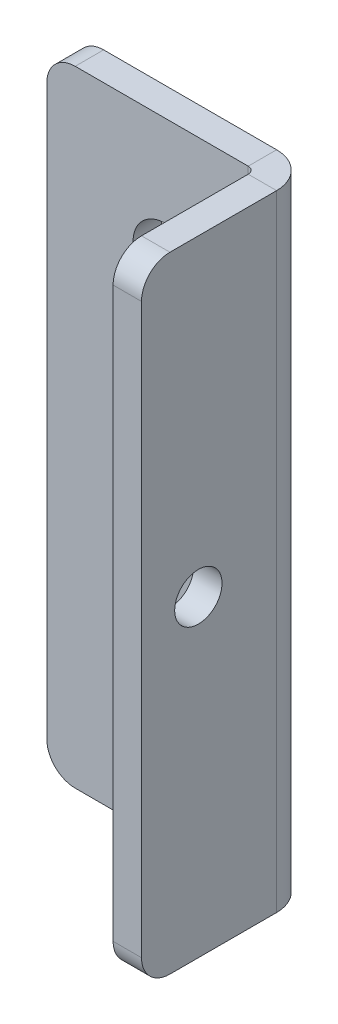
ISO-10303-21;
HEADER;
FILE_DESCRIPTION(('STEP AP214'),'2;1');
FILE_NAME('part.step','',(''),(''),'','','');
FILE_SCHEMA(('AUTOMOTIVE_DESIGN { 1 0 10303 214 1 1 1 1 }'));
ENDSEC;
DATA;
#1=APPLICATION_CONTEXT('core data for automotive mechanical design processes');
#2=APPLICATION_PROTOCOL_DEFINITION('international standard','automotive_design',2000,#1);
#3=PRODUCT_CONTEXT('',#1,'mechanical');
#4=PRODUCT('Part','Part','',(#3));
#5=PRODUCT_RELATED_PRODUCT_CATEGORY('part','',(#4));
#6=PRODUCT_DEFINITION_FORMATION('','',#4);
#7=PRODUCT_DEFINITION_CONTEXT('part definition',#1,'design');
#8=PRODUCT_DEFINITION('design','',#6,#7);
#9=PRODUCT_DEFINITION_SHAPE('','',#8);
#10=(LENGTH_UNIT() NAMED_UNIT(*) SI_UNIT(.MILLI.,.METRE.));
#11=(NAMED_UNIT(*) PLANE_ANGLE_UNIT() SI_UNIT($,.RADIAN.));
#12=(NAMED_UNIT(*) SI_UNIT($,.STERADIAN.) SOLID_ANGLE_UNIT());
#13=UNCERTAINTY_MEASURE_WITH_UNIT(LENGTH_MEASURE(1.E-05),#10,'distance_accuracy_value','');
#14=(GEOMETRIC_REPRESENTATION_CONTEXT(3) GLOBAL_UNCERTAINTY_ASSIGNED_CONTEXT((#13)) GLOBAL_UNIT_ASSIGNED_CONTEXT((#10,
#11,#12)) REPRESENTATION_CONTEXT('',''));
#15=CARTESIAN_POINT('',(0.,0.,0.));
#16=DIRECTION('',(0.,0.,1.));
#17=DIRECTION('',(1.,0.,0.));
#18=AXIS2_PLACEMENT_3D('',#15,#16,#17);
#19=CARTESIAN_POINT('',(-12.5,33.,-3.));
#20=DIRECTION('',(0.,1.,0.));
#21=DIRECTION('',(0.,0.,1.));
#22=AXIS2_PLACEMENT_3D('',#19,#20,#21);
#23=PLANE('',#22);
#24=DIRECTION('',(-1.,0.,0.));
#25=VECTOR('',#24,1.);
#26=CARTESIAN_POINT('',(-12.5,33.,-3.));
#27=LINE('',#26,#25);
#28=CARTESIAN_POINT('',(8.7634,33.,-3.));
#29=VERTEX_POINT('',#28);
#30=CARTESIAN_POINT('',(-9.5,33.,-3.));
#31=VERTEX_POINT('',#30);
#32=EDGE_CURVE('E226',#29,#31,#27,.T.);
#33=ORIENTED_EDGE('',*,*,#32,.T.);
#34=DIRECTION('',(0.,0.,1.));
#35=VECTOR('',#34,1.);
#36=CARTESIAN_POINT('',(-9.5,33.,-3.));
#37=LINE('',#36,#35);
#38=CARTESIAN_POINT('',(-9.5,33.,0.));
#39=VERTEX_POINT('',#38);
#40=EDGE_CURVE('E13',#31,#39,#37,.T.);
#41=ORIENTED_EDGE('',*,*,#40,.T.);
#42=DIRECTION('',(-1.,0.,0.));
#43=VECTOR('',#42,1.);
#44=CARTESIAN_POINT('',(-12.5,33.,0.));
#45=LINE('',#44,#43);
#46=CARTESIAN_POINT('',(8.7634,33.,0.));
#47=VERTEX_POINT('',#46);
#48=EDGE_CURVE('E224',#47,#39,#45,.T.);
#49=ORIENTED_EDGE('',*,*,#48,.F.);
#50=DIRECTION('',(0.,0.,-1.));
#51=VECTOR('',#50,1.);
#52=CARTESIAN_POINT('',(8.7634,33.,0.));
#53=LINE('',#52,#51);
#54=EDGE_CURVE('E213',#47,#29,#53,.T.);
#55=ORIENTED_EDGE('',*,*,#54,.T.);
#56=EDGE_LOOP('',(#33,#41,#49,#55));
#57=FACE_BOUND('',#56,.T.);
#58=ADVANCED_FACE('F65',(#57),#23,.T.);
#59=CARTESIAN_POINT('',(0.,0.,-3.));
#60=DIRECTION('',(0.,0.,-1.));
#61=DIRECTION('',(-1.,0.,0.));
#62=AXIS2_PLACEMENT_3D('',#59,#60,#61);
#63=PLANE('',#62);
#64=CARTESIAN_POINT('',(0.,20.,-3.));
#65=DIRECTION('',(0.,0.,1.));
#66=DIRECTION('',(1.,0.,0.));
#67=AXIS2_PLACEMENT_3D('',#64,#65,#66);
#68=CIRCLE('',#67,3.4);
#69=CARTESIAN_POINT('',(3.39999999999999,20.,-3.));
#70=VERTEX_POINT('',#69);
#71=EDGE_CURVE('E315',#70,#70,#68,.T.);
#72=ORIENTED_EDGE('',*,*,#71,.T.);
#73=EDGE_LOOP('',(#72));
#74=FACE_BOUND('',#73,.T.);
#75=CARTESIAN_POINT('',(0.,-20.,-3.));
#76=DIRECTION('',(0.,0.,1.));
#77=DIRECTION('',(1.,0.,0.));
#78=AXIS2_PLACEMENT_3D('',#75,#76,#77);
#79=CIRCLE('',#78,3.4);
#80=CARTESIAN_POINT('',(3.4,-20.,-3.));
#81=VERTEX_POINT('',#80);
#82=EDGE_CURVE('E210',#81,#81,#79,.T.);
#83=ORIENTED_EDGE('',*,*,#82,.T.);
#84=EDGE_LOOP('',(#83));
#85=FACE_BOUND('',#84,.T.);
#86=DIRECTION('',(1.,0.,0.));
#87=VECTOR('',#86,1.);
#88=CARTESIAN_POINT('',(-12.5,-33.,-3.));
#89=LINE('',#88,#87);
#90=CARTESIAN_POINT('',(-9.5,-33.,-3.));
#91=VERTEX_POINT('',#90);
#92=CARTESIAN_POINT('',(8.7634,-33.,-3.));
#93=VERTEX_POINT('',#92);
#94=EDGE_CURVE('E232',#91,#93,#89,.T.);
#95=ORIENTED_EDGE('',*,*,#94,.F.);
#96=CARTESIAN_POINT('',(-9.5,-30.,-3.));
#97=DIRECTION('',(0.,0.,-1.));
#98=DIRECTION('',(-1.,0.,0.));
#99=AXIS2_PLACEMENT_3D('',#96,#97,#98);
#100=CIRCLE('',#99,3.);
#101=CARTESIAN_POINT('',(-12.5,-30.,-3.));
#102=VERTEX_POINT('',#101);
#103=EDGE_CURVE('E73',#91,#102,#100,.T.);
#104=ORIENTED_EDGE('',*,*,#103,.T.);
#105=DIRECTION('',(0.,-1.,0.));
#106=VECTOR('',#105,1.);
#107=CARTESIAN_POINT('',(-12.5,-33.,-3.));
#108=LINE('',#107,#106);
#109=CARTESIAN_POINT('',(-12.5,30.,-3.));
#110=VERTEX_POINT('',#109);
#111=EDGE_CURVE('E228',#110,#102,#108,.T.);
#112=ORIENTED_EDGE('',*,*,#111,.F.);
#113=CARTESIAN_POINT('',(-9.5,30.,-3.));
#114=DIRECTION('',(0.,0.,-1.));
#115=DIRECTION('',(-1.,0.,0.));
#116=AXIS2_PLACEMENT_3D('',#113,#114,#115);
#117=CIRCLE('',#116,3.);
#118=EDGE_CURVE('E80',#110,#31,#117,.T.);
#119=ORIENTED_EDGE('',*,*,#118,.T.);
#120=ORIENTED_EDGE('',*,*,#32,.F.);
#121=DIRECTION('',(0.,1.,0.));
#122=VECTOR('',#121,1.);
#123=CARTESIAN_POINT('',(8.7634,33.,-3.));
#124=LINE('',#123,#122);
#125=EDGE_CURVE('E165',#29,#93,#124,.F.);
#126=ORIENTED_EDGE('',*,*,#125,.T.);
#127=EDGE_LOOP('',(#95,#104,#112,#119,#120,#126));
#128=FACE_BOUND('',#127,.T.);
#129=ADVANCED_FACE('F268',(#74,#85,#128),#63,.T.);
#130=CARTESIAN_POINT('',(0.,0.,0.));
#131=DIRECTION('',(0.,0.,-1.));
#132=DIRECTION('',(-1.,0.,0.));
#133=AXIS2_PLACEMENT_3D('',#130,#131,#132);
#134=PLANE('',#133);
#135=CARTESIAN_POINT('',(0.,20.,0.));
#136=DIRECTION('',(0.,0.,1.));
#137=DIRECTION('',(1.,0.,0.));
#138=AXIS2_PLACEMENT_3D('',#135,#136,#137);
#139=CIRCLE('',#138,3.4);
#140=CARTESIAN_POINT('',(3.39999999999999,20.,0.));
#141=VERTEX_POINT('',#140);
#142=EDGE_CURVE('E318',#141,#141,#139,.T.);
#143=ORIENTED_EDGE('',*,*,#142,.F.);
#144=EDGE_LOOP('',(#143));
#145=FACE_BOUND('',#144,.T.);
#146=CARTESIAN_POINT('',(0.,-20.,0.));
#147=DIRECTION('',(0.,0.,1.));
#148=DIRECTION('',(1.,0.,0.));
#149=AXIS2_PLACEMENT_3D('',#146,#147,#148);
#150=CIRCLE('',#149,3.4);
#151=CARTESIAN_POINT('',(3.4,-20.,0.));
#152=VERTEX_POINT('',#151);
#153=EDGE_CURVE('E312',#152,#152,#150,.T.);
#154=ORIENTED_EDGE('',*,*,#153,.F.);
#155=EDGE_LOOP('',(#154));
#156=FACE_BOUND('',#155,.T.);
#157=DIRECTION('',(0.,-1.,0.));
#158=VECTOR('',#157,1.);
#159=CARTESIAN_POINT('',(-12.5,-33.,0.));
#160=LINE('',#159,#158);
#161=CARTESIAN_POINT('',(-12.5,30.,0.));
#162=VERTEX_POINT('',#161);
#163=CARTESIAN_POINT('',(-12.5,-30.,0.));
#164=VERTEX_POINT('',#163);
#165=EDGE_CURVE('E237',#162,#164,#160,.T.);
#166=ORIENTED_EDGE('',*,*,#165,.T.);
#167=CARTESIAN_POINT('',(-9.5,-30.,0.));
#168=DIRECTION('',(0.,0.,-1.));
#169=DIRECTION('',(-1.,0.,0.));
#170=AXIS2_PLACEMENT_3D('',#167,#168,#169);
#171=CIRCLE('',#170,3.);
#172=CARTESIAN_POINT('',(-9.5,-33.,0.));
#173=VERTEX_POINT('',#172);
#174=EDGE_CURVE('E264',#164,#173,#171,.F.);
#175=ORIENTED_EDGE('',*,*,#174,.T.);
#176=DIRECTION('',(1.,0.,0.));
#177=VECTOR('',#176,1.);
#178=CARTESIAN_POINT('',(-12.5,-33.,0.));
#179=LINE('',#178,#177);
#180=CARTESIAN_POINT('',(8.7634,-33.,0.));
#181=VERTEX_POINT('',#180);
#182=EDGE_CURVE('E229',#173,#181,#179,.T.);
#183=ORIENTED_EDGE('',*,*,#182,.T.);
#184=DIRECTION('',(0.,1.,0.));
#185=VECTOR('',#184,1.);
#186=CARTESIAN_POINT('',(8.7634,33.,0.));
#187=LINE('',#186,#185);
#188=EDGE_CURVE('E217',#47,#181,#187,.F.);
#189=ORIENTED_EDGE('',*,*,#188,.F.);
#190=ORIENTED_EDGE('',*,*,#48,.T.);
#191=CARTESIAN_POINT('',(-9.5,30.,0.));
#192=DIRECTION('',(0.,0.,-1.));
#193=DIRECTION('',(-1.,0.,0.));
#194=AXIS2_PLACEMENT_3D('',#191,#192,#193);
#195=CIRCLE('',#194,3.);
#196=EDGE_CURVE('E262',#39,#162,#195,.F.);
#197=ORIENTED_EDGE('',*,*,#196,.T.);
#198=EDGE_LOOP('',(#166,#175,#183,#189,#190,#197));
#199=FACE_BOUND('',#198,.T.);
#200=ADVANCED_FACE('F277',(#145,#156,#199),#134,.F.);
#201=CARTESIAN_POINT('',(-12.5,-33.,-3.));
#202=DIRECTION('',(0.,-1.,0.));
#203=DIRECTION('',(0.,0.,-1.));
#204=AXIS2_PLACEMENT_3D('',#201,#202,#203);
#205=PLANE('',#204);
#206=ORIENTED_EDGE('',*,*,#182,.F.);
#207=DIRECTION('',(0.,0.,1.));
#208=VECTOR('',#207,1.);
#209=CARTESIAN_POINT('',(-9.5,-33.,-3.));
#210=LINE('',#209,#208);
#211=EDGE_CURVE('E88',#173,#91,#210,.F.);
#212=ORIENTED_EDGE('',*,*,#211,.T.);
#213=ORIENTED_EDGE('',*,*,#94,.T.);
#214=DIRECTION('',(0.,0.,-1.));
#215=VECTOR('',#214,1.);
#216=CARTESIAN_POINT('',(8.7634,-33.,0.));
#217=LINE('',#216,#215);
#218=EDGE_CURVE('E221',#181,#93,#217,.T.);
#219=ORIENTED_EDGE('',*,*,#218,.F.);
#220=EDGE_LOOP('',(#206,#212,#213,#219));
#221=FACE_BOUND('',#220,.T.);
#222=ADVANCED_FACE('F280',(#221),#205,.T.);
#223=CARTESIAN_POINT('',(-12.5,-33.,-3.));
#224=DIRECTION('',(-1.,0.,0.));
#225=DIRECTION('',(0.,0.,1.));
#226=AXIS2_PLACEMENT_3D('',#223,#224,#225);
#227=PLANE('',#226);
#228=ORIENTED_EDGE('',*,*,#111,.T.);
#229=DIRECTION('',(0.,0.,1.));
#230=VECTOR('',#229,1.);
#231=CARTESIAN_POINT('',(-12.5,-30.,-3.));
#232=LINE('',#231,#230);
#233=EDGE_CURVE('E259',#102,#164,#232,.T.);
#234=ORIENTED_EDGE('',*,*,#233,.T.);
#235=ORIENTED_EDGE('',*,*,#165,.F.);
#236=DIRECTION('',(0.,0.,1.));
#237=VECTOR('',#236,1.);
#238=CARTESIAN_POINT('',(-12.5,30.,-3.));
#239=LINE('',#238,#237);
#240=EDGE_CURVE('E257',#162,#110,#239,.F.);
#241=ORIENTED_EDGE('',*,*,#240,.T.);
#242=EDGE_LOOP('',(#228,#234,#235,#241));
#243=FACE_BOUND('',#242,.T.);
#244=ADVANCED_FACE('F272',(#243),#227,.T.);
#245=CARTESIAN_POINT('',(8.7634,-33.,0.7366));
#246=DIRECTION('',(0.,-1.,0.));
#247=DIRECTION('',(0.,0.,-1.));
#248=AXIS2_PLACEMENT_3D('',#245,#246,#247);
#249=PLANE('',#248);
#250=DIRECTION('',(-1.,0.,0.));
#251=VECTOR('',#250,1.);
#252=CARTESIAN_POINT('',(12.5,-33.,0.736599999999986));
#253=LINE('',#252,#251);
#254=CARTESIAN_POINT('',(9.50000000000001,-33.,0.736599999999998));
#255=VERTEX_POINT('',#254);
#256=CARTESIAN_POINT('',(12.5,-33.,0.736599999999987));
#257=VERTEX_POINT('',#256);
#258=EDGE_CURVE('E207',#255,#257,#253,.F.);
#259=ORIENTED_EDGE('',*,*,#258,.F.);
#260=CARTESIAN_POINT('',(8.7634,-33.,0.7366));
#261=DIRECTION('',(0.,1.,0.));
#262=DIRECTION('',(0.,0.,1.));
#263=AXIS2_PLACEMENT_3D('',#260,#261,#262);
#264=CIRCLE('',#263,0.7366);
#265=EDGE_CURVE('E168',#181,#255,#264,.F.);
#266=ORIENTED_EDGE('',*,*,#265,.F.);
#267=ORIENTED_EDGE('',*,*,#218,.T.);
#268=CARTESIAN_POINT('',(8.7634,-33.,0.7366));
#269=DIRECTION('',(0.,1.,0.));
#270=DIRECTION('',(0.,0.,1.));
#271=AXIS2_PLACEMENT_3D('',#268,#269,#270);
#272=CIRCLE('',#271,3.7366);
#273=EDGE_CURVE('E212',#93,#257,#272,.F.);
#274=ORIENTED_EDGE('',*,*,#273,.T.);
#275=EDGE_LOOP('',(#259,#266,#267,#274));
#276=FACE_BOUND('',#275,.T.);
#277=ADVANCED_FACE('F284',(#276),#249,.T.);
#278=CARTESIAN_POINT('',(8.7634,33.,0.7366));
#279=DIRECTION('',(0.,-1.,0.));
#280=DIRECTION('',(0.,0.,-1.));
#281=AXIS2_PLACEMENT_3D('',#278,#279,#280);
#282=PLANE('',#281);
#283=CARTESIAN_POINT('',(8.7634,33.,0.7366));
#284=DIRECTION('',(0.,1.,0.));
#285=DIRECTION('',(0.,0.,1.));
#286=AXIS2_PLACEMENT_3D('',#283,#284,#285);
#287=CIRCLE('',#286,0.7366);
#288=CARTESIAN_POINT('',(9.50000000000001,33.,0.736599999999998));
#289=VERTEX_POINT('',#288);
#290=EDGE_CURVE('E175',#289,#47,#287,.T.);
#291=ORIENTED_EDGE('',*,*,#290,.F.);
#292=DIRECTION('',(-1.,0.,0.));
#293=VECTOR('',#292,1.);
#294=CARTESIAN_POINT('',(9.5,33.,0.736599999999999));
#295=LINE('',#294,#293);
#296=CARTESIAN_POINT('',(12.5,33.,0.736599999999988));
#297=VERTEX_POINT('',#296);
#298=EDGE_CURVE('E172',#289,#297,#295,.F.);
#299=ORIENTED_EDGE('',*,*,#298,.T.);
#300=CARTESIAN_POINT('',(8.7634,33.,0.7366));
#301=DIRECTION('',(0.,1.,0.));
#302=DIRECTION('',(0.,0.,1.));
#303=AXIS2_PLACEMENT_3D('',#300,#301,#302);
#304=CIRCLE('',#303,3.7366);
#305=EDGE_CURVE('E157',#297,#29,#304,.T.);
#306=ORIENTED_EDGE('',*,*,#305,.T.);
#307=ORIENTED_EDGE('',*,*,#54,.F.);
#308=EDGE_LOOP('',(#291,#299,#306,#307));
#309=FACE_BOUND('',#308,.T.);
#310=ADVANCED_FACE('F173',(#309),#282,.F.);
#311=CARTESIAN_POINT('',(8.7634,33.,0.7366));
#312=DIRECTION('',(0.,1.,0.));
#313=DIRECTION('',(1.,0.,0.));
#314=AXIS2_PLACEMENT_3D('',#311,#312,#313);
#315=CYLINDRICAL_SURFACE('',#314,3.7366);
#316=ORIENTED_EDGE('',*,*,#125,.F.);
#317=ORIENTED_EDGE('',*,*,#305,.F.);
#318=DIRECTION('',(0.,1.,0.));
#319=VECTOR('',#318,1.);
#320=CARTESIAN_POINT('',(12.5,-33.,0.736599999999986));
#321=LINE('',#320,#319);
#322=EDGE_CURVE('E162',#297,#257,#321,.F.);
#323=ORIENTED_EDGE('',*,*,#322,.T.);
#324=ORIENTED_EDGE('',*,*,#273,.F.);
#325=EDGE_LOOP('',(#316,#317,#323,#324));
#326=FACE_BOUND('',#325,.T.);
#327=ADVANCED_FACE('F159',(#326),#315,.T.);
#328=CARTESIAN_POINT('',(8.7634,33.,0.7366));
#329=DIRECTION('',(0.,1.,0.));
#330=DIRECTION('',(1.,0.,0.));
#331=AXIS2_PLACEMENT_3D('',#328,#329,#330);
#332=CYLINDRICAL_SURFACE('',#331,0.7366);
#333=ORIENTED_EDGE('',*,*,#188,.T.);
#334=ORIENTED_EDGE('',*,*,#265,.T.);
#335=DIRECTION('',(0.,1.,0.));
#336=VECTOR('',#335,1.);
#337=CARTESIAN_POINT('',(9.5,-33.,0.736599999999997));
#338=LINE('',#337,#336);
#339=EDGE_CURVE('E180',#255,#289,#338,.T.);
#340=ORIENTED_EDGE('',*,*,#339,.T.);
#341=ORIENTED_EDGE('',*,*,#290,.T.);
#342=EDGE_LOOP('',(#333,#334,#340,#341));
#343=FACE_BOUND('',#342,.T.);
#344=ADVANCED_FACE('F290',(#343),#332,.F.);
#345=CARTESIAN_POINT('',(12.5000000000001,33.,15.));
#346=DIRECTION('',(0.,-1.,0.));
#347=DIRECTION('',(0.,0.,-1.));
#348=AXIS2_PLACEMENT_3D('',#345,#346,#347);
#349=PLANE('',#348);
#350=DIRECTION('',(0.,0.,-1.));
#351=VECTOR('',#350,1.);
#352=CARTESIAN_POINT('',(9.50000000000005,33.,15.));
#353=LINE('',#352,#351);
#354=CARTESIAN_POINT('',(9.50000000000004,33.,12.));
#355=VERTEX_POINT('',#354);
#356=EDGE_CURVE('E190',#289,#355,#353,.F.);
#357=ORIENTED_EDGE('',*,*,#356,.T.);
#358=DIRECTION('',(-1.,0.,0.));
#359=VECTOR('',#358,1.);
#360=CARTESIAN_POINT('',(12.5,33.,12.));
#361=LINE('',#360,#359);
#362=CARTESIAN_POINT('',(12.5,33.,12.));
#363=VERTEX_POINT('',#362);
#364=EDGE_CURVE('E194',#355,#363,#361,.F.);
#365=ORIENTED_EDGE('',*,*,#364,.T.);
#366=DIRECTION('',(0.,0.,1.));
#367=VECTOR('',#366,1.);
#368=CARTESIAN_POINT('',(12.5,33.,0.));
#369=LINE('',#368,#367);
#370=EDGE_CURVE('E186',#297,#363,#369,.T.);
#371=ORIENTED_EDGE('',*,*,#370,.F.);
#372=ORIENTED_EDGE('',*,*,#298,.F.);
#373=EDGE_LOOP('',(#357,#365,#371,#372));
#374=FACE_BOUND('',#373,.T.);
#375=ADVANCED_FACE('F192',(#374),#349,.F.);
#376=CARTESIAN_POINT('',(12.5,-33.,0.));
#377=DIRECTION('',(0.,1.,0.));
#378=DIRECTION('',(0.,0.,1.));
#379=AXIS2_PLACEMENT_3D('',#376,#377,#378);
#380=PLANE('',#379);
#381=DIRECTION('',(0.,0.,-1.));
#382=VECTOR('',#381,1.);
#383=CARTESIAN_POINT('',(12.5,-33.,0.));
#384=LINE('',#383,#382);
#385=CARTESIAN_POINT('',(12.5,-33.,12.));
#386=VERTEX_POINT('',#385);
#387=EDGE_CURVE('E189',#386,#257,#384,.T.);
#388=ORIENTED_EDGE('',*,*,#387,.F.);
#389=DIRECTION('',(-1.,0.,0.));
#390=VECTOR('',#389,1.);
#391=CARTESIAN_POINT('',(12.5,-33.,12.));
#392=LINE('',#391,#390);
#393=CARTESIAN_POINT('',(9.50000000000004,-33.,12.));
#394=VERTEX_POINT('',#393);
#395=EDGE_CURVE('E234',#386,#394,#392,.T.);
#396=ORIENTED_EDGE('',*,*,#395,.T.);
#397=DIRECTION('',(0.,0.,1.));
#398=VECTOR('',#397,1.);
#399=CARTESIAN_POINT('',(9.5,-33.,0.));
#400=LINE('',#399,#398);
#401=EDGE_CURVE('E196',#394,#255,#400,.F.);
#402=ORIENTED_EDGE('',*,*,#401,.T.);
#403=ORIENTED_EDGE('',*,*,#258,.T.);
#404=EDGE_LOOP('',(#388,#396,#402,#403));
#405=FACE_BOUND('',#404,.T.);
#406=ADVANCED_FACE('F308',(#405),#380,.F.);
#407=CARTESIAN_POINT('',(12.5,0.,0.));
#408=DIRECTION('',(-1.,0.,0.));
#409=DIRECTION('',(0.,0.,1.));
#410=AXIS2_PLACEMENT_3D('',#407,#408,#409);
#411=PLANE('',#410);
#412=CARTESIAN_POINT('',(12.5,0.,9.));
#413=DIRECTION('',(-1.,0.,0.));
#414=DIRECTION('',(0.,0.,1.));
#415=AXIS2_PLACEMENT_3D('',#412,#413,#414);
#416=CIRCLE('',#415,2.5);
#417=CARTESIAN_POINT('',(12.5,0.,11.5));
#418=VERTEX_POINT('',#417);
#419=EDGE_CURVE('E321',#418,#418,#416,.T.);
#420=ORIENTED_EDGE('',*,*,#419,.T.);
#421=EDGE_LOOP('',(#420));
#422=FACE_BOUND('',#421,.T.);
#423=DIRECTION('',(0.,-1.,0.));
#424=VECTOR('',#423,1.);
#425=CARTESIAN_POINT('',(12.5000000000001,0.,15.));
#426=LINE('',#425,#424);
#427=CARTESIAN_POINT('',(12.5000000000001,30.,15.));
#428=VERTEX_POINT('',#427);
#429=CARTESIAN_POINT('',(12.5000000000001,-30.,15.));
#430=VERTEX_POINT('',#429);
#431=EDGE_CURVE('E195',#428,#430,#426,.T.);
#432=ORIENTED_EDGE('',*,*,#431,.T.);
#433=CARTESIAN_POINT('',(12.5,-30.,12.));
#434=DIRECTION('',(-1.,0.,0.));
#435=DIRECTION('',(0.,0.,1.));
#436=AXIS2_PLACEMENT_3D('',#433,#434,#435);
#437=CIRCLE('',#436,3.);
#438=EDGE_CURVE('E254',#430,#386,#437,.F.);
#439=ORIENTED_EDGE('',*,*,#438,.T.);
#440=ORIENTED_EDGE('',*,*,#387,.T.);
#441=ORIENTED_EDGE('',*,*,#322,.F.);
#442=ORIENTED_EDGE('',*,*,#370,.T.);
#443=CARTESIAN_POINT('',(12.5,30.,12.));
#444=DIRECTION('',(-1.,0.,0.));
#445=DIRECTION('',(0.,0.,1.));
#446=AXIS2_PLACEMENT_3D('',#443,#444,#445);
#447=CIRCLE('',#446,3.);
#448=EDGE_CURVE('E252',#363,#428,#447,.F.);
#449=ORIENTED_EDGE('',*,*,#448,.T.);
#450=EDGE_LOOP('',(#432,#439,#440,#441,#442,#449));
#451=FACE_BOUND('',#450,.T.);
#452=ADVANCED_FACE('F185',(#422,#451),#411,.F.);
#453=CARTESIAN_POINT('',(9.5,0.,0.));
#454=DIRECTION('',(-1.,0.,0.));
#455=DIRECTION('',(0.,0.,1.));
#456=AXIS2_PLACEMENT_3D('',#453,#454,#455);
#457=PLANE('',#456);
#458=CARTESIAN_POINT('',(9.50000000000003,0.,9.00000000000001));
#459=DIRECTION('',(-1.,0.,0.));
#460=DIRECTION('',(0.,0.,1.));
#461=AXIS2_PLACEMENT_3D('',#458,#459,#460);
#462=CIRCLE('',#461,2.5);
#463=CARTESIAN_POINT('',(9.50000000000004,0.,11.5));
#464=VERTEX_POINT('',#463);
#465=EDGE_CURVE('E324',#464,#464,#462,.T.);
#466=ORIENTED_EDGE('',*,*,#465,.F.);
#467=EDGE_LOOP('',(#466));
#468=FACE_BOUND('',#467,.T.);
#469=ORIENTED_EDGE('',*,*,#401,.F.);
#470=CARTESIAN_POINT('',(9.50000000000004,-30.,12.));
#471=DIRECTION('',(-1.,0.,0.));
#472=DIRECTION('',(0.,0.,1.));
#473=AXIS2_PLACEMENT_3D('',#470,#471,#472);
#474=CIRCLE('',#473,3.);
#475=CARTESIAN_POINT('',(9.50000000000005,-30.,15.));
#476=VERTEX_POINT('',#475);
#477=EDGE_CURVE('E245',#394,#476,#474,.T.);
#478=ORIENTED_EDGE('',*,*,#477,.T.);
#479=DIRECTION('',(0.,1.,0.));
#480=VECTOR('',#479,1.);
#481=CARTESIAN_POINT('',(9.50000000000005,-33.,15.));
#482=LINE('',#481,#480);
#483=CARTESIAN_POINT('',(9.50000000000005,30.,15.));
#484=VERTEX_POINT('',#483);
#485=EDGE_CURVE('E199',#484,#476,#482,.F.);
#486=ORIENTED_EDGE('',*,*,#485,.F.);
#487=CARTESIAN_POINT('',(9.50000000000004,30.,12.));
#488=DIRECTION('',(-1.,0.,0.));
#489=DIRECTION('',(0.,0.,1.));
#490=AXIS2_PLACEMENT_3D('',#487,#488,#489);
#491=CIRCLE('',#490,3.);
#492=EDGE_CURVE('E243',#484,#355,#491,.T.);
#493=ORIENTED_EDGE('',*,*,#492,.T.);
#494=ORIENTED_EDGE('',*,*,#356,.F.);
#495=ORIENTED_EDGE('',*,*,#339,.F.);
#496=EDGE_LOOP('',(#469,#478,#486,#493,#494,#495));
#497=FACE_BOUND('',#496,.T.);
#498=ADVANCED_FACE('F294',(#468,#497),#457,.T.);
#499=CARTESIAN_POINT('',(12.5000000000001,-33.,15.));
#500=DIRECTION('',(0.,0.,-1.));
#501=DIRECTION('',(-1.,0.,0.));
#502=AXIS2_PLACEMENT_3D('',#499,#500,#501);
#503=PLANE('',#502);
#504=ORIENTED_EDGE('',*,*,#485,.T.);
#505=DIRECTION('',(-1.,0.,0.));
#506=VECTOR('',#505,1.);
#507=CARTESIAN_POINT('',(12.5000000000001,-30.,15.));
#508=LINE('',#507,#506);
#509=EDGE_CURVE('E250',#476,#430,#508,.F.);
#510=ORIENTED_EDGE('',*,*,#509,.T.);
#511=ORIENTED_EDGE('',*,*,#431,.F.);
#512=DIRECTION('',(-1.,0.,0.));
#513=VECTOR('',#512,1.);
#514=CARTESIAN_POINT('',(12.5000000000001,30.,15.));
#515=LINE('',#514,#513);
#516=EDGE_CURVE('E247',#428,#484,#515,.T.);
#517=ORIENTED_EDGE('',*,*,#516,.T.);
#518=EDGE_LOOP('',(#504,#510,#511,#517));
#519=FACE_BOUND('',#518,.T.);
#520=ADVANCED_FACE('F302',(#519),#503,.F.);
#521=CARTESIAN_POINT('',(0.,-20.,0.));
#522=DIRECTION('',(0.,0.,1.));
#523=DIRECTION('',(1.,0.,0.));
#524=AXIS2_PLACEMENT_3D('',#521,#522,#523);
#525=CYLINDRICAL_SURFACE('',#524,3.4);
#526=ORIENTED_EDGE('',*,*,#82,.F.);
#527=EDGE_LOOP('',(#526));
#528=FACE_BOUND('',#527,.T.);
#529=ORIENTED_EDGE('',*,*,#153,.T.);
#530=EDGE_LOOP('',(#529));
#531=FACE_BOUND('',#530,.T.);
#532=ADVANCED_FACE('F336',(#528,#531),#525,.F.);
#533=CARTESIAN_POINT('',(0.,20.,0.));
#534=DIRECTION('',(0.,0.,1.));
#535=DIRECTION('',(1.,0.,0.));
#536=AXIS2_PLACEMENT_3D('',#533,#534,#535);
#537=CYLINDRICAL_SURFACE('',#536,3.4);
#538=ORIENTED_EDGE('',*,*,#71,.F.);
#539=EDGE_LOOP('',(#538));
#540=FACE_BOUND('',#539,.T.);
#541=ORIENTED_EDGE('',*,*,#142,.T.);
#542=EDGE_LOOP('',(#541));
#543=FACE_BOUND('',#542,.T.);
#544=ADVANCED_FACE('F391',(#540,#543),#537,.F.);
#545=CARTESIAN_POINT('',(9.50000000000003,0.,9.00000000000001));
#546=DIRECTION('',(-1.,0.,0.));
#547=DIRECTION('',(0.,0.,1.));
#548=AXIS2_PLACEMENT_3D('',#545,#546,#547);
#549=CYLINDRICAL_SURFACE('',#548,2.5);
#550=ORIENTED_EDGE('',*,*,#419,.F.);
#551=EDGE_LOOP('',(#550));
#552=FACE_BOUND('',#551,.T.);
#553=ORIENTED_EDGE('',*,*,#465,.T.);
#554=EDGE_LOOP('',(#553));
#555=FACE_BOUND('',#554,.T.);
#556=ADVANCED_FACE('F328',(#552,#555),#549,.F.);
#557=CARTESIAN_POINT('',(12.5,-30.,12.));
#558=DIRECTION('',(-1.,0.,0.));
#559=DIRECTION('',(0.,0.,1.));
#560=AXIS2_PLACEMENT_3D('',#557,#558,#559);
#561=CYLINDRICAL_SURFACE('',#560,3.);
#562=ORIENTED_EDGE('',*,*,#438,.F.);
#563=ORIENTED_EDGE('',*,*,#509,.F.);
#564=ORIENTED_EDGE('',*,*,#477,.F.);
#565=ORIENTED_EDGE('',*,*,#395,.F.);
#566=EDGE_LOOP('',(#562,#563,#564,#565));
#567=FACE_BOUND('',#566,.T.);
#568=ADVANCED_FACE('F305',(#567),#561,.T.);
#569=CARTESIAN_POINT('',(12.5,30.,12.));
#570=DIRECTION('',(-1.,0.,0.));
#571=DIRECTION('',(0.,0.,1.));
#572=AXIS2_PLACEMENT_3D('',#569,#570,#571);
#573=CYLINDRICAL_SURFACE('',#572,3.);
#574=ORIENTED_EDGE('',*,*,#448,.F.);
#575=ORIENTED_EDGE('',*,*,#364,.F.);
#576=ORIENTED_EDGE('',*,*,#492,.F.);
#577=ORIENTED_EDGE('',*,*,#516,.F.);
#578=EDGE_LOOP('',(#574,#575,#576,#577));
#579=FACE_BOUND('',#578,.T.);
#580=ADVANCED_FACE('F297',(#579),#573,.T.);
#581=CARTESIAN_POINT('',(-9.5,-30.,-3.));
#582=DIRECTION('',(0.,0.,1.));
#583=DIRECTION('',(1.,0.,0.));
#584=AXIS2_PLACEMENT_3D('',#581,#582,#583);
#585=CYLINDRICAL_SURFACE('',#584,3.);
#586=ORIENTED_EDGE('',*,*,#103,.F.);
#587=ORIENTED_EDGE('',*,*,#211,.F.);
#588=ORIENTED_EDGE('',*,*,#174,.F.);
#589=ORIENTED_EDGE('',*,*,#233,.F.);
#590=EDGE_LOOP('',(#586,#587,#588,#589));
#591=FACE_BOUND('',#590,.T.);
#592=ADVANCED_FACE('F275',(#591),#585,.T.);
#593=CARTESIAN_POINT('',(-9.5,30.,-3.));
#594=DIRECTION('',(0.,0.,1.));
#595=DIRECTION('',(1.,0.,0.));
#596=AXIS2_PLACEMENT_3D('',#593,#594,#595);
#597=CYLINDRICAL_SURFACE('',#596,3.);
#598=ORIENTED_EDGE('',*,*,#118,.F.);
#599=ORIENTED_EDGE('',*,*,#240,.F.);
#600=ORIENTED_EDGE('',*,*,#196,.F.);
#601=ORIENTED_EDGE('',*,*,#40,.F.);
#602=EDGE_LOOP('',(#598,#599,#600,#601));
#603=FACE_BOUND('',#602,.T.);
#604=ADVANCED_FACE('F67',(#603),#597,.T.);
#605=CLOSED_SHELL('',(#58,#129,#200,#222,#244,#277,#310,#327,#344,#375,#406,#452,#498,#520,#532,
#544,#556,#568,#580,#592,#604));
#606=MANIFOLD_SOLID_BREP('B2',#605);
#607=ADVANCED_BREP_SHAPE_REPRESENTATION('',(#18,#606),#14);
#608=SHAPE_DEFINITION_REPRESENTATION(#9,#607);
ENDSEC;
END-ISO-10303-21;
